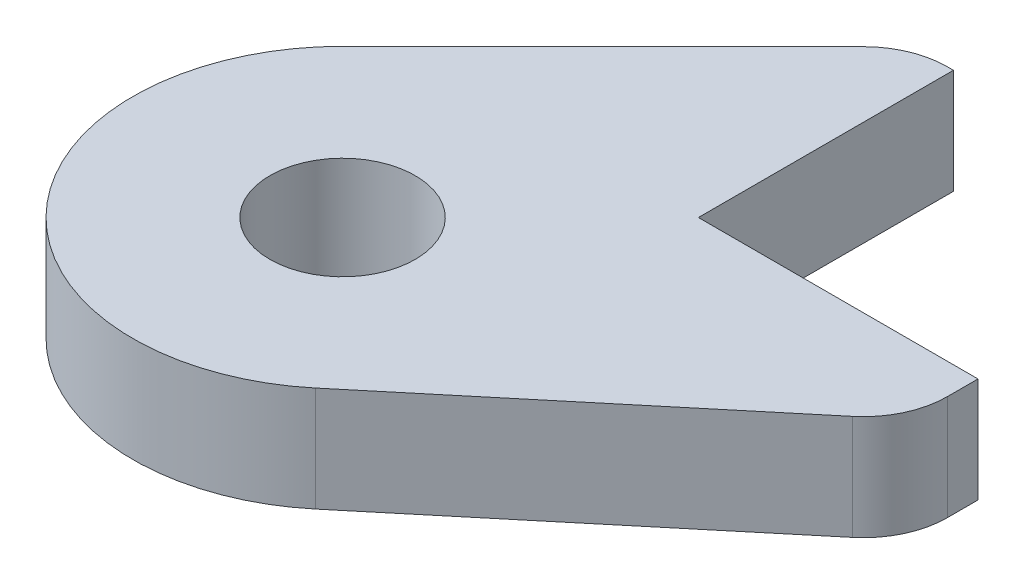
ISO-10303-21;
HEADER;
FILE_DESCRIPTION(('STEP AP214'),'2;1');
FILE_NAME('part.step','',(''),(''),'','','');
FILE_SCHEMA(('AUTOMOTIVE_DESIGN { 1 0 10303 214 1 1 1 1 }'));
ENDSEC;
DATA;
#1=APPLICATION_CONTEXT('core data for automotive mechanical design processes');
#2=APPLICATION_PROTOCOL_DEFINITION('international standard','automotive_design',2000,#1);
#3=PRODUCT_CONTEXT('',#1,'mechanical');
#4=PRODUCT('Part','Part','',(#3));
#5=PRODUCT_RELATED_PRODUCT_CATEGORY('part','',(#4));
#6=PRODUCT_DEFINITION_FORMATION('','',#4);
#7=PRODUCT_DEFINITION_CONTEXT('part definition',#1,'design');
#8=PRODUCT_DEFINITION('design','',#6,#7);
#9=PRODUCT_DEFINITION_SHAPE('','',#8);
#10=(LENGTH_UNIT() NAMED_UNIT(*) SI_UNIT(.MILLI.,.METRE.));
#11=(NAMED_UNIT(*) PLANE_ANGLE_UNIT() SI_UNIT($,.RADIAN.));
#12=(NAMED_UNIT(*) SI_UNIT($,.STERADIAN.) SOLID_ANGLE_UNIT());
#13=UNCERTAINTY_MEASURE_WITH_UNIT(LENGTH_MEASURE(1.E-05),#10,'distance_accuracy_value','');
#14=(GEOMETRIC_REPRESENTATION_CONTEXT(3) GLOBAL_UNCERTAINTY_ASSIGNED_CONTEXT((#13)) GLOBAL_UNIT_ASSIGNED_CONTEXT((#10,
#11,#12)) REPRESENTATION_CONTEXT('',''));
#15=CARTESIAN_POINT('',(0.,0.,0.));
#16=DIRECTION('',(0.,0.,1.));
#17=DIRECTION('',(1.,0.,0.));
#18=AXIS2_PLACEMENT_3D('',#15,#16,#17);
#19=CARTESIAN_POINT('',(-12.7,4.7625,12.7));
#20=DIRECTION('',(0.,0.,1.));
#21=DIRECTION('',(1.,0.,0.));
#22=AXIS2_PLACEMENT_3D('',#19,#20,#21);
#23=PLANE('',#22);
#24=DIRECTION('',(-1.,0.,0.));
#25=VECTOR('',#24,1.);
#26=CARTESIAN_POINT('',(-12.7,0.,12.7));
#27=LINE('',#26,#25);
#28=CARTESIAN_POINT('',(0.,0.,12.7));
#29=VERTEX_POINT('',#28);
#30=CARTESIAN_POINT('',(-12.7,0.,12.7));
#31=VERTEX_POINT('',#30);
#32=EDGE_CURVE('E134',#29,#31,#27,.T.);
#33=ORIENTED_EDGE('',*,*,#32,.T.);
#34=DIRECTION('',(0.,-1.,0.));
#35=VECTOR('',#34,1.);
#36=CARTESIAN_POINT('',(-12.7,4.7625,12.7));
#37=LINE('',#36,#35);
#38=CARTESIAN_POINT('',(-12.7,4.7625,12.7));
#39=VERTEX_POINT('',#38);
#40=EDGE_CURVE('E116',#39,#31,#37,.T.);
#41=ORIENTED_EDGE('',*,*,#40,.F.);
#42=DIRECTION('',(-1.,0.,0.));
#43=VECTOR('',#42,1.);
#44=CARTESIAN_POINT('',(-12.7,4.7625,12.7));
#45=LINE('',#44,#43);
#46=CARTESIAN_POINT('',(0.,4.7625,12.7));
#47=VERTEX_POINT('',#46);
#48=EDGE_CURVE('E121',#47,#39,#45,.T.);
#49=ORIENTED_EDGE('',*,*,#48,.F.);
#50=DIRECTION('',(0.,-1.,0.));
#51=VECTOR('',#50,1.);
#52=CARTESIAN_POINT('',(0.,4.7625,12.7));
#53=LINE('',#52,#51);
#54=EDGE_CURVE('E179',#47,#29,#53,.T.);
#55=ORIENTED_EDGE('',*,*,#54,.T.);
#56=EDGE_LOOP('',(#33,#41,#49,#55));
#57=FACE_BOUND('',#56,.T.);
#58=ADVANCED_FACE('F41',(#57),#23,.F.);
#59=CARTESIAN_POINT('',(-12.7,4.7625,1.11592316367925));
#60=DIRECTION('',(-1.,0.,0.));
#61=DIRECTION('',(0.,0.,1.));
#62=AXIS2_PLACEMENT_3D('',#59,#60,#61);
#63=PLANE('',#62);
#64=DIRECTION('',(0.,0.,-1.));
#65=VECTOR('',#64,1.);
#66=CARTESIAN_POINT('',(-12.7,0.,1.11592316367925));
#67=LINE('',#66,#65);
#68=CARTESIAN_POINT('',(-12.7,0.,1.11592316367925));
#69=VERTEX_POINT('',#68);
#70=EDGE_CURVE('E172',#31,#69,#67,.T.);
#71=ORIENTED_EDGE('',*,*,#70,.T.);
#72=DIRECTION('',(0.,-1.,0.));
#73=VECTOR('',#72,1.);
#74=CARTESIAN_POINT('',(-12.7,4.7625,1.11592316367925));
#75=LINE('',#74,#73);
#76=CARTESIAN_POINT('',(-12.7,4.7625,1.11592316367925));
#77=VERTEX_POINT('',#76);
#78=EDGE_CURVE('E119',#77,#69,#75,.T.);
#79=ORIENTED_EDGE('',*,*,#78,.F.);
#80=DIRECTION('',(0.,0.,-1.));
#81=VECTOR('',#80,1.);
#82=CARTESIAN_POINT('',(-12.7,4.7625,1.11592316367925));
#83=LINE('',#82,#81);
#84=EDGE_CURVE('E112',#39,#77,#83,.T.);
#85=ORIENTED_EDGE('',*,*,#84,.F.);
#86=ORIENTED_EDGE('',*,*,#40,.T.);
#87=EDGE_LOOP('',(#71,#79,#85,#86));
#88=FACE_BOUND('',#87,.T.);
#89=ADVANCED_FACE('F114',(#88),#63,.F.);
#90=CARTESIAN_POINT('',(-12.7,4.7625,1.11592316367925));
#91=DIRECTION('',(0.,0.,1.));
#92=DIRECTION('',(1.,0.,0.));
#93=AXIS2_PLACEMENT_3D('',#90,#91,#92);
#94=PLANE('',#93);
#95=DIRECTION('',(-1.,0.,0.));
#96=VECTOR('',#95,1.);
#97=CARTESIAN_POINT('',(-12.7,0.,1.11592316367925));
#98=LINE('',#97,#96);
#99=CARTESIAN_POINT('',(-12.9790527856403,0.,1.11592316367925));
#100=VERTEX_POINT('',#99);
#101=EDGE_CURVE('E168',#69,#100,#98,.T.);
#102=ORIENTED_EDGE('',*,*,#101,.T.);
#103=DIRECTION('',(0.,-1.,0.));
#104=VECTOR('',#103,1.);
#105=CARTESIAN_POINT('',(-12.9790527856403,4.7625,1.11592316367925));
#106=LINE('',#105,#104);
#107=CARTESIAN_POINT('',(-12.9790527856403,4.7625,1.11592316367925));
#108=VERTEX_POINT('',#107);
#109=EDGE_CURVE('E11',#100,#108,#106,.F.);
#110=ORIENTED_EDGE('',*,*,#109,.T.);
#111=DIRECTION('',(-1.,0.,0.));
#112=VECTOR('',#111,1.);
#113=CARTESIAN_POINT('',(-12.7,4.7625,1.11592316367925));
#114=LINE('',#113,#112);
#115=EDGE_CURVE('E120',#77,#108,#114,.T.);
#116=ORIENTED_EDGE('',*,*,#115,.F.);
#117=ORIENTED_EDGE('',*,*,#78,.T.);
#118=EDGE_LOOP('',(#102,#110,#116,#117));
#119=FACE_BOUND('',#118,.T.);
#120=ADVANCED_FACE('F197',(#119),#94,.F.);
#121=CARTESIAN_POINT('',(-14.5544614371684,4.7625,1.11592316367925));
#122=DIRECTION('',(0.706236330961077,0.,0.707976161202223));
#123=DIRECTION('',(0.707976161202223,0.,-0.706236330961077));
#124=AXIS2_PLACEMENT_3D('',#121,#122,#123);
#125=PLANE('',#124);
#126=DIRECTION('',(-0.707976161202223,0.,0.706236330961077));
#127=VECTOR('',#126,1.);
#128=CARTESIAN_POINT('',(-14.5544614371684,4.7625,1.11592316367925));
#129=LINE('',#128,#127);
#130=CARTESIAN_POINT('',(-15.669813206602,4.7625,2.22853398949878));
#131=VERTEX_POINT('',#130);
#132=CARTESIAN_POINT('',(-27.5091315613665,4.7625,14.0387575735111));
#133=VERTEX_POINT('',#132);
#134=EDGE_CURVE('E159',#131,#133,#129,.T.);
#135=ORIENTED_EDGE('',*,*,#134,.F.);
#136=DIRECTION('',(0.,-1.,0.));
#137=VECTOR('',#136,1.);
#138=CARTESIAN_POINT('',(-15.669813206602,4.7625,2.22853398949878));
#139=LINE('',#138,#137);
#140=CARTESIAN_POINT('',(-15.669813206602,0.,2.22853398949878));
#141=VERTEX_POINT('',#140);
#142=EDGE_CURVE('E49',#131,#141,#139,.T.);
#143=ORIENTED_EDGE('',*,*,#142,.T.);
#144=DIRECTION('',(-0.707976161202223,0.,0.706236330961077));
#145=VECTOR('',#144,1.);
#146=CARTESIAN_POINT('',(-14.5544614371684,0.,1.11592316367925));
#147=LINE('',#146,#145);
#148=CARTESIAN_POINT('',(-27.5091315613665,0.,14.0387575735111));
#149=VERTEX_POINT('',#148);
#150=EDGE_CURVE('E157',#141,#149,#147,.T.);
#151=ORIENTED_EDGE('',*,*,#150,.T.);
#152=DIRECTION('',(0.,-1.,0.));
#153=VECTOR('',#152,1.);
#154=CARTESIAN_POINT('',(-27.5091315613665,4.7625,14.0387575735111));
#155=LINE('',#154,#153);
#156=EDGE_CURVE('E140',#133,#149,#155,.T.);
#157=ORIENTED_EDGE('',*,*,#156,.F.);
#158=EDGE_LOOP('',(#135,#143,#151,#157));
#159=FACE_BOUND('',#158,.T.);
#160=ADVANCED_FACE('F155',(#159),#125,.F.);
#161=CARTESIAN_POINT('',(-20.7822305089622,4.7625,20.7822305089622));
#162=DIRECTION('',(0.,-1.,0.));
#163=DIRECTION('',(0.,0.,-1.));
#164=AXIS2_PLACEMENT_3D('',#161,#162,#163);
#165=CYLINDRICAL_SURFACE('',#164,9.525);
#166=CARTESIAN_POINT('',(-20.7822305089622,0.,20.7822305089622));
#167=DIRECTION('',(0.,1.,0.));
#168=DIRECTION('',(0.,0.,1.));
#169=AXIS2_PLACEMENT_3D('',#166,#167,#168);
#170=CIRCLE('',#169,9.525);
#171=CARTESIAN_POINT('',(-14.6881588853513,0.,28.1026072783847));
#172=VERTEX_POINT('',#171);
#173=EDGE_CURVE('E167',#149,#172,#170,.T.);
#174=ORIENTED_EDGE('',*,*,#173,.T.);
#175=DIRECTION('',(0.,-1.,0.));
#176=VECTOR('',#175,1.);
#177=CARTESIAN_POINT('',(-14.6881588853513,4.7625,28.1026072783847));
#178=LINE('',#177,#176);
#179=CARTESIAN_POINT('',(-14.6881588853513,4.7625,28.1026072783847));
#180=VERTEX_POINT('',#179);
#181=EDGE_CURVE('E181',#180,#172,#178,.T.);
#182=ORIENTED_EDGE('',*,*,#181,.F.);
#183=CARTESIAN_POINT('',(-20.7822305089622,4.7625,20.7822305089622));
#184=DIRECTION('',(0.,1.,0.));
#185=DIRECTION('',(0.,0.,1.));
#186=AXIS2_PLACEMENT_3D('',#183,#184,#185);
#187=CIRCLE('',#186,9.525);
#188=EDGE_CURVE('E187',#133,#180,#187,.T.);
#189=ORIENTED_EDGE('',*,*,#188,.F.);
#190=ORIENTED_EDGE('',*,*,#156,.T.);
#191=EDGE_LOOP('',(#174,#182,#189,#190));
#192=FACE_BOUND('',#191,.T.);
#193=ADVANCED_FACE('F185',(#192),#165,.T.);
#194=CARTESIAN_POINT('',(0.,4.7625,15.875));
#195=DIRECTION('',(-0.639797545785926,0.,-0.768543492852751));
#196=DIRECTION('',(-0.768543492852751,0.,0.639797545785926));
#197=AXIS2_PLACEMENT_3D('',#194,#195,#196);
#198=PLANE('',#197);
#199=DIRECTION('',(0.768543492852751,0.,-0.639797545785926));
#200=VECTOR('',#199,1.);
#201=CARTESIAN_POINT('',(0.,0.,15.875));
#202=LINE('',#201,#200);
#203=CARTESIAN_POINT('',(-1.37237135055562,0.,17.0174725212794));
#204=VERTEX_POINT('',#203);
#205=EDGE_CURVE('E170',#172,#204,#202,.T.);
#206=ORIENTED_EDGE('',*,*,#205,.T.);
#207=DIRECTION('',(0.,-1.,0.));
#208=VECTOR('',#207,1.);
#209=CARTESIAN_POINT('',(-1.37237135055562,4.7625,17.0174725212794));
#210=LINE('',#209,#208);
#211=CARTESIAN_POINT('',(-1.37237135055562,4.7625,17.0174725212794));
#212=VERTEX_POINT('',#211);
#213=EDGE_CURVE('E147',#204,#212,#210,.F.);
#214=ORIENTED_EDGE('',*,*,#213,.T.);
#215=DIRECTION('',(0.768543492852751,0.,-0.639797545785926));
#216=VECTOR('',#215,1.);
#217=CARTESIAN_POINT('',(0.,4.7625,15.875));
#218=LINE('',#217,#216);
#219=EDGE_CURVE('E189',#180,#212,#218,.T.);
#220=ORIENTED_EDGE('',*,*,#219,.F.);
#221=ORIENTED_EDGE('',*,*,#181,.T.);
#222=EDGE_LOOP('',(#206,#214,#220,#221));
#223=FACE_BOUND('',#222,.T.);
#224=ADVANCED_FACE('F217',(#223),#198,.F.);
#225=CARTESIAN_POINT('',(0.,4.7625,12.7));
#226=DIRECTION('',(-1.,0.,0.));
#227=DIRECTION('',(0.,0.,1.));
#228=AXIS2_PLACEMENT_3D('',#225,#226,#227);
#229=PLANE('',#228);
#230=DIRECTION('',(0.,0.,-1.));
#231=VECTOR('',#230,1.);
#232=CARTESIAN_POINT('',(0.,4.7625,12.7));
#233=LINE('',#232,#231);
#234=CARTESIAN_POINT('',(0.,4.7625,14.0893218135105));
#235=VERTEX_POINT('',#234);
#236=EDGE_CURVE('E127',#235,#47,#233,.T.);
#237=ORIENTED_EDGE('',*,*,#236,.F.);
#238=DIRECTION('',(0.,-1.,0.));
#239=VECTOR('',#238,1.);
#240=CARTESIAN_POINT('',(0.,4.7625,14.0893218135105));
#241=LINE('',#240,#239);
#242=CARTESIAN_POINT('',(0.,0.,14.0893218135105));
#243=VERTEX_POINT('',#242);
#244=EDGE_CURVE('E135',#235,#243,#241,.T.);
#245=ORIENTED_EDGE('',*,*,#244,.T.);
#246=DIRECTION('',(0.,0.,-1.));
#247=VECTOR('',#246,1.);
#248=CARTESIAN_POINT('',(0.,0.,12.7));
#249=LINE('',#248,#247);
#250=EDGE_CURVE('E131',#243,#29,#249,.T.);
#251=ORIENTED_EDGE('',*,*,#250,.T.);
#252=ORIENTED_EDGE('',*,*,#54,.F.);
#253=EDGE_LOOP('',(#237,#245,#251,#252));
#254=FACE_BOUND('',#253,.T.);
#255=ADVANCED_FACE('F208',(#254),#229,.F.);
#256=CARTESIAN_POINT('',(-20.7822305089622,4.7625,20.7822305089622));
#257=DIRECTION('',(0.,1.,0.));
#258=DIRECTION('',(0.,0.,1.));
#259=AXIS2_PLACEMENT_3D('',#256,#257,#258);
#260=PLANE('',#259);
#261=CARTESIAN_POINT('',(-20.7822305089622,4.7625,20.7822305089622));
#262=DIRECTION('',(0.,1.,0.));
#263=DIRECTION('',(0.,0.,1.));
#264=AXIS2_PLACEMENT_3D('',#261,#262,#263);
#265=CIRCLE('',#264,3.29999999999999);
#266=CARTESIAN_POINT('',(-20.7822305089622,4.7625,24.0822305089622));
#267=VERTEX_POINT('',#266);
#268=EDGE_CURVE('E201',#267,#267,#265,.T.);
#269=ORIENTED_EDGE('',*,*,#268,.F.);
#270=EDGE_LOOP('',(#269));
#271=FACE_BOUND('',#270,.T.);
#272=ORIENTED_EDGE('',*,*,#219,.T.);
#273=CARTESIAN_POINT('',(-3.81,4.7625,14.0893218135105));
#274=DIRECTION('',(0.,1.,0.));
#275=DIRECTION('',(0.,0.,1.));
#276=AXIS2_PLACEMENT_3D('',#273,#274,#275);
#277=CIRCLE('',#276,3.81);
#278=EDGE_CURVE('E150',#212,#235,#277,.T.);
#279=ORIENTED_EDGE('',*,*,#278,.T.);
#280=ORIENTED_EDGE('',*,*,#236,.T.);
#281=ORIENTED_EDGE('',*,*,#48,.T.);
#282=ORIENTED_EDGE('',*,*,#84,.T.);
#283=ORIENTED_EDGE('',*,*,#115,.T.);
#284=CARTESIAN_POINT('',(-12.9790527856403,4.7625,4.92592316367925));
#285=DIRECTION('',(0.,1.,0.));
#286=DIRECTION('',(0.,0.,1.));
#287=AXIS2_PLACEMENT_3D('',#284,#285,#286);
#288=CIRCLE('',#287,3.81);
#289=EDGE_CURVE('E56',#108,#131,#288,.T.);
#290=ORIENTED_EDGE('',*,*,#289,.T.);
#291=ORIENTED_EDGE('',*,*,#134,.T.);
#292=ORIENTED_EDGE('',*,*,#188,.T.);
#293=EDGE_LOOP('',(#272,#279,#280,#281,#282,#283,#290,#291,#292));
#294=FACE_BOUND('',#293,.T.);
#295=ADVANCED_FACE('F125',(#271,#294),#260,.T.);
#296=CARTESIAN_POINT('',(-20.7822305089622,0.,20.7822305089622));
#297=DIRECTION('',(0.,1.,0.));
#298=DIRECTION('',(0.,0.,1.));
#299=AXIS2_PLACEMENT_3D('',#296,#297,#298);
#300=PLANE('',#299);
#301=CARTESIAN_POINT('',(-20.7822305089622,0.,20.7822305089622));
#302=DIRECTION('',(0.,1.,0.));
#303=DIRECTION('',(0.,0.,1.));
#304=AXIS2_PLACEMENT_3D('',#301,#302,#303);
#305=CIRCLE('',#304,3.3);
#306=CARTESIAN_POINT('',(-20.7822305089622,0.,24.0822305089622));
#307=VERTEX_POINT('',#306);
#308=EDGE_CURVE('E196',#307,#307,#305,.T.);
#309=ORIENTED_EDGE('',*,*,#308,.T.);
#310=EDGE_LOOP('',(#309));
#311=FACE_BOUND('',#310,.T.);
#312=ORIENTED_EDGE('',*,*,#250,.F.);
#313=CARTESIAN_POINT('',(-3.81,0.,14.0893218135105));
#314=DIRECTION('',(0.,1.,0.));
#315=DIRECTION('',(0.,0.,1.));
#316=AXIS2_PLACEMENT_3D('',#313,#314,#315);
#317=CIRCLE('',#316,3.81);
#318=EDGE_CURVE('E145',#243,#204,#317,.F.);
#319=ORIENTED_EDGE('',*,*,#318,.T.);
#320=ORIENTED_EDGE('',*,*,#205,.F.);
#321=ORIENTED_EDGE('',*,*,#173,.F.);
#322=ORIENTED_EDGE('',*,*,#150,.F.);
#323=CARTESIAN_POINT('',(-12.9790527856403,0.,4.92592316367925));
#324=DIRECTION('',(0.,1.,0.));
#325=DIRECTION('',(0.,0.,1.));
#326=AXIS2_PLACEMENT_3D('',#323,#324,#325);
#327=CIRCLE('',#326,3.81);
#328=EDGE_CURVE('E138',#141,#100,#327,.F.);
#329=ORIENTED_EDGE('',*,*,#328,.T.);
#330=ORIENTED_EDGE('',*,*,#101,.F.);
#331=ORIENTED_EDGE('',*,*,#70,.F.);
#332=ORIENTED_EDGE('',*,*,#32,.F.);
#333=EDGE_LOOP('',(#312,#319,#320,#321,#322,#329,#330,#331,#332));
#334=FACE_BOUND('',#333,.T.);
#335=ADVANCED_FACE('F164',(#311,#334),#300,.F.);
#336=CARTESIAN_POINT('',(-3.81,4.7625,14.0893218135105));
#337=DIRECTION('',(0.,-1.,0.));
#338=DIRECTION('',(0.,0.,-1.));
#339=AXIS2_PLACEMENT_3D('',#336,#337,#338);
#340=CYLINDRICAL_SURFACE('',#339,3.81);
#341=ORIENTED_EDGE('',*,*,#278,.F.);
#342=ORIENTED_EDGE('',*,*,#213,.F.);
#343=ORIENTED_EDGE('',*,*,#318,.F.);
#344=ORIENTED_EDGE('',*,*,#244,.F.);
#345=EDGE_LOOP('',(#341,#342,#343,#344));
#346=FACE_BOUND('',#345,.T.);
#347=ADVANCED_FACE('F214',(#346),#340,.T.);
#348=CARTESIAN_POINT('',(-12.9790527856403,4.7625,4.92592316367925));
#349=DIRECTION('',(0.,-1.,0.));
#350=DIRECTION('',(0.,0.,-1.));
#351=AXIS2_PLACEMENT_3D('',#348,#349,#350);
#352=CYLINDRICAL_SURFACE('',#351,3.81);
#353=ORIENTED_EDGE('',*,*,#289,.F.);
#354=ORIENTED_EDGE('',*,*,#109,.F.);
#355=ORIENTED_EDGE('',*,*,#328,.F.);
#356=ORIENTED_EDGE('',*,*,#142,.F.);
#357=EDGE_LOOP('',(#353,#354,#355,#356));
#358=FACE_BOUND('',#357,.T.);
#359=ADVANCED_FACE('F43',(#358),#352,.T.);
#360=CARTESIAN_POINT('',(-20.7822305089622,4.7625,20.7822305089622));
#361=DIRECTION('',(0.,1.,0.));
#362=DIRECTION('',(0.,0.,1.));
#363=AXIS2_PLACEMENT_3D('',#360,#361,#362);
#364=CYLINDRICAL_SURFACE('',#363,3.29999999999999);
#365=ORIENTED_EDGE('',*,*,#308,.F.);
#366=EDGE_LOOP('',(#365));
#367=FACE_BOUND('',#366,.T.);
#368=ORIENTED_EDGE('',*,*,#268,.T.);
#369=EDGE_LOOP('',(#368));
#370=FACE_BOUND('',#369,.T.);
#371=ADVANCED_FACE('F205',(#367,#370),#364,.F.);
#372=CLOSED_SHELL('',(#58,#89,#120,#160,#193,#224,#255,#295,#335,#347,#359,#371));
#373=MANIFOLD_SOLID_BREP('B2',#372);
#374=ADVANCED_BREP_SHAPE_REPRESENTATION('',(#18,#373),#14);
#375=SHAPE_DEFINITION_REPRESENTATION(#9,#374);
ENDSEC;
END-ISO-10303-21;
